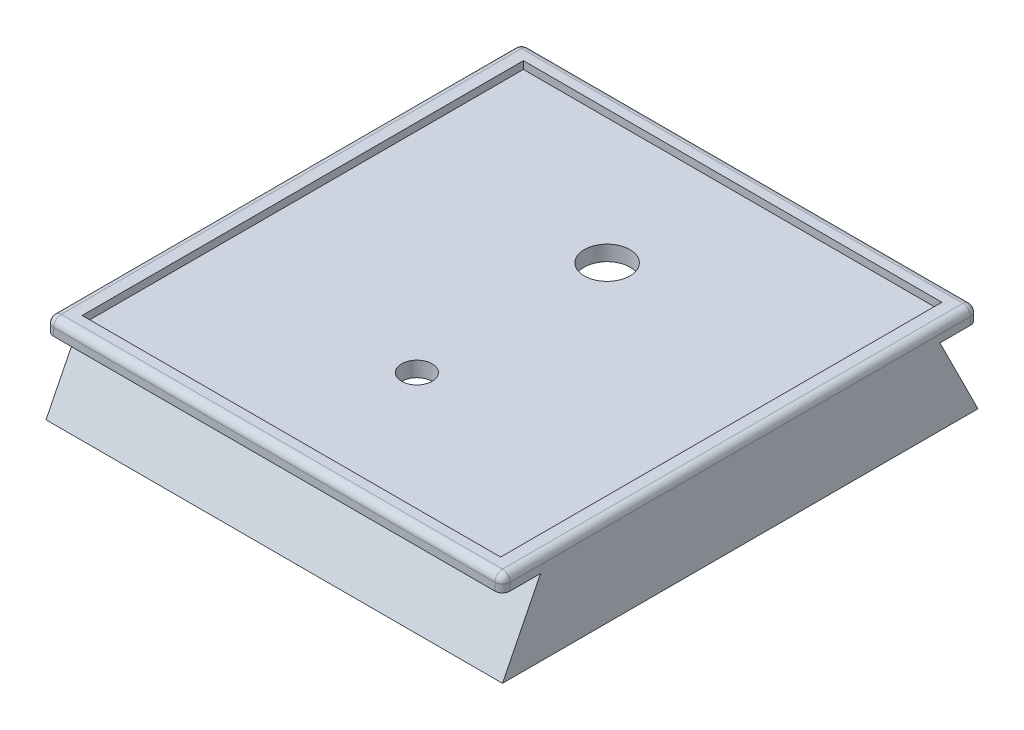
ISO-10303-21;
HEADER;
FILE_DESCRIPTION(('STEP AP214'),'2;1');
FILE_NAME('part.step','',(''),(''),'','','');
FILE_SCHEMA(('AUTOMOTIVE_DESIGN { 1 0 10303 214 1 1 1 1 }'));
ENDSEC;
DATA;
#1=APPLICATION_CONTEXT('core data for automotive mechanical design processes');
#2=APPLICATION_PROTOCOL_DEFINITION('international standard','automotive_design',2000,#1);
#3=PRODUCT_CONTEXT('',#1,'mechanical');
#4=PRODUCT('Part','Part','',(#3));
#5=PRODUCT_RELATED_PRODUCT_CATEGORY('part','',(#4));
#6=PRODUCT_DEFINITION_FORMATION('','',#4);
#7=PRODUCT_DEFINITION_CONTEXT('part definition',#1,'design');
#8=PRODUCT_DEFINITION('design','',#6,#7);
#9=PRODUCT_DEFINITION_SHAPE('','',#8);
#10=(LENGTH_UNIT() NAMED_UNIT(*) SI_UNIT(.MILLI.,.METRE.));
#11=(NAMED_UNIT(*) PLANE_ANGLE_UNIT() SI_UNIT($,.RADIAN.));
#12=(NAMED_UNIT(*) SI_UNIT($,.STERADIAN.) SOLID_ANGLE_UNIT());
#13=UNCERTAINTY_MEASURE_WITH_UNIT(LENGTH_MEASURE(1.E-05),#10,'distance_accuracy_value','');
#14=(GEOMETRIC_REPRESENTATION_CONTEXT(3) GLOBAL_UNCERTAINTY_ASSIGNED_CONTEXT((#13)) GLOBAL_UNIT_ASSIGNED_CONTEXT((#10,
#11,#12)) REPRESENTATION_CONTEXT('',''));
#15=CARTESIAN_POINT('',(0.,0.,0.));
#16=DIRECTION('',(0.,0.,1.));
#17=DIRECTION('',(1.,0.,0.));
#18=AXIS2_PLACEMENT_3D('',#15,#16,#17);
#19=CARTESIAN_POINT('',(-30.,10.,31.25));
#20=DIRECTION('',(1.,0.,0.));
#21=DIRECTION('',(0.,0.,-1.));
#22=AXIS2_PLACEMENT_3D('',#19,#20,#21);
#23=PLANE('',#22);
#24=DIRECTION('',(0.,-1.,0.));
#25=VECTOR('',#24,1.);
#26=CARTESIAN_POINT('',(-30.,10.,30.25));
#27=LINE('',#26,#25);
#28=CARTESIAN_POINT('',(-30.,10.,30.25));
#29=VERTEX_POINT('',#28);
#30=CARTESIAN_POINT('',(-30.,11.,30.25));
#31=VERTEX_POINT('',#30);
#32=EDGE_CURVE('E314',#29,#31,#27,.F.);
#33=ORIENTED_EDGE('',*,*,#32,.T.);
#34=DIRECTION('',(0.,0.,1.));
#35=VECTOR('',#34,1.);
#36=CARTESIAN_POINT('',(-30.,11.,-30.25));
#37=LINE('',#36,#35);
#38=CARTESIAN_POINT('',(-30.,11.,-30.25));
#39=VERTEX_POINT('',#38);
#40=EDGE_CURVE('E343',#31,#39,#37,.F.);
#41=ORIENTED_EDGE('',*,*,#40,.T.);
#42=DIRECTION('',(0.,-1.,0.));
#43=VECTOR('',#42,1.);
#44=CARTESIAN_POINT('',(-30.,10.,-30.25));
#45=LINE('',#44,#43);
#46=CARTESIAN_POINT('',(-30.,10.,-30.25));
#47=VERTEX_POINT('',#46);
#48=EDGE_CURVE('E319',#39,#47,#45,.T.);
#49=ORIENTED_EDGE('',*,*,#48,.T.);
#50=DIRECTION('',(0.,0.,1.));
#51=VECTOR('',#50,1.);
#52=CARTESIAN_POINT('',(-30.,10.,-31.25));
#53=LINE('',#52,#51);
#54=CARTESIAN_POINT('',(-30.,10.,-26.25));
#55=VERTEX_POINT('',#54);
#56=EDGE_CURVE('E275',#47,#55,#53,.T.);
#57=ORIENTED_EDGE('',*,*,#56,.T.);
#58=DIRECTION('',(0.,-0.894427190999916,-0.447213595499958));
#59=VECTOR('',#58,1.);
#60=CARTESIAN_POINT('',(-30.,0.,-31.25));
#61=LINE('',#60,#59);
#62=CARTESIAN_POINT('',(-30.,0.,-31.25));
#63=VERTEX_POINT('',#62);
#64=EDGE_CURVE('E283',#55,#63,#61,.T.);
#65=ORIENTED_EDGE('',*,*,#64,.T.);
#66=DIRECTION('',(0.,0.,1.));
#67=VECTOR('',#66,1.);
#68=CARTESIAN_POINT('',(-30.,0.,31.25));
#69=LINE('',#68,#67);
#70=CARTESIAN_POINT('',(-30.,0.,31.25));
#71=VERTEX_POINT('',#70);
#72=EDGE_CURVE('E293',#63,#71,#69,.T.);
#73=ORIENTED_EDGE('',*,*,#72,.T.);
#74=DIRECTION('',(0.,0.894427190999916,-0.447213595499958));
#75=VECTOR('',#74,1.);
#76=CARTESIAN_POINT('',(-30.,0.,31.25));
#77=LINE('',#76,#75);
#78=CARTESIAN_POINT('',(-30.,10.,26.25));
#79=VERTEX_POINT('',#78);
#80=EDGE_CURVE('E273',#71,#79,#77,.T.);
#81=ORIENTED_EDGE('',*,*,#80,.T.);
#82=EDGE_CURVE('E272',#79,#29,#53,.T.);
#83=ORIENTED_EDGE('',*,*,#82,.T.);
#84=EDGE_LOOP('',(#33,#41,#49,#57,#65,#73,#81,#83));
#85=FACE_BOUND('',#84,.T.);
#86=ADVANCED_FACE('F39',(#85),#23,.F.);
#87=CARTESIAN_POINT('',(30.,10.,31.25));
#88=DIRECTION('',(-1.,0.,0.));
#89=DIRECTION('',(0.,0.,1.));
#90=AXIS2_PLACEMENT_3D('',#87,#88,#89);
#91=PLANE('',#90);
#92=DIRECTION('',(0.,-1.,0.));
#93=VECTOR('',#92,1.);
#94=CARTESIAN_POINT('',(30.,10.,-30.25));
#95=LINE('',#94,#93);
#96=CARTESIAN_POINT('',(30.,10.,-30.25));
#97=VERTEX_POINT('',#96);
#98=CARTESIAN_POINT('',(30.,11.,-30.25));
#99=VERTEX_POINT('',#98);
#100=EDGE_CURVE('E315',#97,#99,#95,.F.);
#101=ORIENTED_EDGE('',*,*,#100,.T.);
#102=DIRECTION('',(0.,0.,-1.));
#103=VECTOR('',#102,1.);
#104=CARTESIAN_POINT('',(30.,11.,30.25));
#105=LINE('',#104,#103);
#106=CARTESIAN_POINT('',(30.,11.,30.25));
#107=VERTEX_POINT('',#106);
#108=EDGE_CURVE('E11',#99,#107,#105,.F.);
#109=ORIENTED_EDGE('',*,*,#108,.T.);
#110=DIRECTION('',(0.,-1.,0.));
#111=VECTOR('',#110,1.);
#112=CARTESIAN_POINT('',(30.,10.,30.25));
#113=LINE('',#112,#111);
#114=CARTESIAN_POINT('',(30.,10.,30.25));
#115=VERTEX_POINT('',#114);
#116=EDGE_CURVE('E309',#107,#115,#113,.T.);
#117=ORIENTED_EDGE('',*,*,#116,.T.);
#118=DIRECTION('',(0.,0.,-1.));
#119=VECTOR('',#118,1.);
#120=CARTESIAN_POINT('',(30.,10.,31.25));
#121=LINE('',#120,#119);
#122=CARTESIAN_POINT('',(30.,10.,26.25));
#123=VERTEX_POINT('',#122);
#124=EDGE_CURVE('E266',#115,#123,#121,.T.);
#125=ORIENTED_EDGE('',*,*,#124,.T.);
#126=DIRECTION('',(0.,0.894427190999916,-0.447213595499958));
#127=VECTOR('',#126,1.);
#128=CARTESIAN_POINT('',(30.,0.,31.25));
#129=LINE('',#128,#127);
#130=CARTESIAN_POINT('',(30.,0.,31.25));
#131=VERTEX_POINT('',#130);
#132=EDGE_CURVE('E274',#131,#123,#129,.T.);
#133=ORIENTED_EDGE('',*,*,#132,.F.);
#134=DIRECTION('',(0.,0.,-1.));
#135=VECTOR('',#134,1.);
#136=CARTESIAN_POINT('',(30.,0.,31.25));
#137=LINE('',#136,#135);
#138=CARTESIAN_POINT('',(30.,0.,-31.25));
#139=VERTEX_POINT('',#138);
#140=EDGE_CURVE('E298',#131,#139,#137,.T.);
#141=ORIENTED_EDGE('',*,*,#140,.T.);
#142=DIRECTION('',(0.,-0.894427190999916,-0.447213595499958));
#143=VECTOR('',#142,1.);
#144=CARTESIAN_POINT('',(30.,0.,-31.25));
#145=LINE('',#144,#143);
#146=CARTESIAN_POINT('',(30.,10.,-26.25));
#147=VERTEX_POINT('',#146);
#148=EDGE_CURVE('E282',#147,#139,#145,.T.);
#149=ORIENTED_EDGE('',*,*,#148,.F.);
#150=EDGE_CURVE('E263',#147,#97,#121,.T.);
#151=ORIENTED_EDGE('',*,*,#150,.T.);
#152=EDGE_LOOP('',(#101,#109,#117,#125,#133,#141,#149,#151));
#153=FACE_BOUND('',#152,.T.);
#154=ADVANCED_FACE('F427',(#153),#91,.F.);
#155=CARTESIAN_POINT('',(0.,0.,0.));
#156=DIRECTION('',(0.,1.,0.));
#157=DIRECTION('',(0.,0.,1.));
#158=AXIS2_PLACEMENT_3D('',#155,#156,#157);
#159=PLANE('',#158);
#160=DIRECTION('',(-1.,0.,0.));
#161=VECTOR('',#160,1.);
#162=CARTESIAN_POINT('',(-25.,0.,25.));
#163=LINE('',#162,#161);
#164=CARTESIAN_POINT('',(25.,0.,25.));
#165=VERTEX_POINT('',#164);
#166=CARTESIAN_POINT('',(-25.,0.,25.));
#167=VERTEX_POINT('',#166);
#168=EDGE_CURVE('E221',#165,#167,#163,.T.);
#169=ORIENTED_EDGE('',*,*,#168,.F.);
#170=DIRECTION('',(0.,0.,1.));
#171=VECTOR('',#170,1.);
#172=CARTESIAN_POINT('',(25.,0.,-25.));
#173=LINE('',#172,#171);
#174=CARTESIAN_POINT('',(25.,0.,-25.));
#175=VERTEX_POINT('',#174);
#176=EDGE_CURVE('E57',#175,#165,#173,.T.);
#177=ORIENTED_EDGE('',*,*,#176,.F.);
#178=DIRECTION('',(1.,0.,0.));
#179=VECTOR('',#178,1.);
#180=CARTESIAN_POINT('',(-25.,0.,-25.));
#181=LINE('',#180,#179);
#182=CARTESIAN_POINT('',(-25.,0.,-25.));
#183=VERTEX_POINT('',#182);
#184=EDGE_CURVE('E209',#183,#175,#181,.T.);
#185=ORIENTED_EDGE('',*,*,#184,.F.);
#186=DIRECTION('',(0.,0.,-1.));
#187=VECTOR('',#186,1.);
#188=CARTESIAN_POINT('',(-25.,0.,-25.));
#189=LINE('',#188,#187);
#190=EDGE_CURVE('E215',#167,#183,#189,.T.);
#191=ORIENTED_EDGE('',*,*,#190,.F.);
#192=EDGE_LOOP('',(#169,#177,#185,#191));
#193=FACE_BOUND('',#192,.T.);
#194=ORIENTED_EDGE('',*,*,#72,.F.);
#195=DIRECTION('',(-1.,0.,0.));
#196=VECTOR('',#195,1.);
#197=CARTESIAN_POINT('',(30.,0.,-31.25));
#198=LINE('',#197,#196);
#199=EDGE_CURVE('E299',#139,#63,#198,.T.);
#200=ORIENTED_EDGE('',*,*,#199,.F.);
#201=ORIENTED_EDGE('',*,*,#140,.F.);
#202=DIRECTION('',(1.,0.,0.));
#203=VECTOR('',#202,1.);
#204=CARTESIAN_POINT('',(30.,0.,31.25));
#205=LINE('',#204,#203);
#206=EDGE_CURVE('E295',#71,#131,#205,.T.);
#207=ORIENTED_EDGE('',*,*,#206,.F.);
#208=EDGE_LOOP('',(#194,#200,#201,#207));
#209=FACE_BOUND('',#208,.T.);
#210=ADVANCED_FACE('F438',(#193,#209),#159,.F.);
#211=CARTESIAN_POINT('',(-30.,0.,-31.25));
#212=DIRECTION('',(0.,-0.447213595499958,0.894427190999916));
#213=DIRECTION('',(0.,-0.894427190999916,-0.447213595499958));
#214=AXIS2_PLACEMENT_3D('',#211,#212,#213);
#215=PLANE('',#214);
#216=ORIENTED_EDGE('',*,*,#148,.T.);
#217=ORIENTED_EDGE('',*,*,#199,.T.);
#218=ORIENTED_EDGE('',*,*,#64,.F.);
#219=DIRECTION('',(1.,0.,0.));
#220=VECTOR('',#219,1.);
#221=CARTESIAN_POINT('',(-30.,10.,-26.25));
#222=LINE('',#221,#220);
#223=EDGE_CURVE('E290',#55,#147,#222,.T.);
#224=ORIENTED_EDGE('',*,*,#223,.T.);
#225=EDGE_LOOP('',(#216,#217,#218,#224));
#226=FACE_BOUND('',#225,.T.);
#227=ADVANCED_FACE('F432',(#226),#215,.F.);
#228=CARTESIAN_POINT('',(-30.,0.,31.25));
#229=DIRECTION('',(0.,-0.447213595499958,-0.894427190999916));
#230=DIRECTION('',(0.,0.894427190999916,-0.447213595499958));
#231=AXIS2_PLACEMENT_3D('',#228,#229,#230);
#232=PLANE('',#231);
#233=ORIENTED_EDGE('',*,*,#132,.T.);
#234=DIRECTION('',(1.,0.,0.));
#235=VECTOR('',#234,1.);
#236=CARTESIAN_POINT('',(-30.,10.,26.25));
#237=LINE('',#236,#235);
#238=EDGE_CURVE('E279',#79,#123,#237,.T.);
#239=ORIENTED_EDGE('',*,*,#238,.F.);
#240=ORIENTED_EDGE('',*,*,#80,.F.);
#241=ORIENTED_EDGE('',*,*,#206,.T.);
#242=EDGE_LOOP('',(#233,#239,#240,#241));
#243=FACE_BOUND('',#242,.T.);
#244=ADVANCED_FACE('F445',(#243),#232,.F.);
#245=CARTESIAN_POINT('',(0.,10.,0.));
#246=DIRECTION('',(0.,1.,0.));
#247=DIRECTION('',(0.,0.,1.));
#248=AXIS2_PLACEMENT_3D('',#245,#246,#247);
#249=PLANE('',#248);
#250=DIRECTION('',(1.,0.,0.));
#251=VECTOR('',#250,1.);
#252=CARTESIAN_POINT('',(-30.,10.,31.25));
#253=LINE('',#252,#251);
#254=CARTESIAN_POINT('',(-29.,10.,31.25));
#255=VERTEX_POINT('',#254);
#256=CARTESIAN_POINT('',(29.,10.,31.25));
#257=VERTEX_POINT('',#256);
#258=EDGE_CURVE('E261',#255,#257,#253,.T.);
#259=ORIENTED_EDGE('',*,*,#258,.F.);
#260=CARTESIAN_POINT('',(-29.,10.,30.25));
#261=DIRECTION('',(0.,1.,0.));
#262=DIRECTION('',(0.,0.,1.));
#263=AXIS2_PLACEMENT_3D('',#260,#261,#262);
#264=CIRCLE('',#263,1.);
#265=EDGE_CURVE('E330',#255,#29,#264,.F.);
#266=ORIENTED_EDGE('',*,*,#265,.T.);
#267=ORIENTED_EDGE('',*,*,#82,.F.);
#268=ORIENTED_EDGE('',*,*,#238,.T.);
#269=ORIENTED_EDGE('',*,*,#124,.F.);
#270=CARTESIAN_POINT('',(29.,10.,30.25));
#271=DIRECTION('',(0.,1.,0.));
#272=DIRECTION('',(0.,0.,1.));
#273=AXIS2_PLACEMENT_3D('',#270,#271,#272);
#274=CIRCLE('',#273,1.);
#275=EDGE_CURVE('E323',#115,#257,#274,.F.);
#276=ORIENTED_EDGE('',*,*,#275,.T.);
#277=EDGE_LOOP('',(#259,#266,#267,#268,#269,#276));
#278=FACE_BOUND('',#277,.T.);
#279=ADVANCED_FACE('F447',(#278),#249,.F.);
#280=CARTESIAN_POINT('',(-30.,12.,31.25));
#281=DIRECTION('',(0.,0.,-1.));
#282=DIRECTION('',(-1.,0.,0.));
#283=AXIS2_PLACEMENT_3D('',#280,#281,#282);
#284=PLANE('',#283);
#285=DIRECTION('',(0.,-1.,0.));
#286=VECTOR('',#285,1.);
#287=CARTESIAN_POINT('',(29.,12.,31.25));
#288=LINE('',#287,#286);
#289=CARTESIAN_POINT('',(29.,11.,31.25));
#290=VERTEX_POINT('',#289);
#291=EDGE_CURVE('E318',#257,#290,#288,.F.);
#292=ORIENTED_EDGE('',*,*,#291,.T.);
#293=DIRECTION('',(1.,0.,0.));
#294=VECTOR('',#293,1.);
#295=CARTESIAN_POINT('',(-29.,11.,31.25));
#296=LINE('',#295,#294);
#297=CARTESIAN_POINT('',(-29.,11.,31.25));
#298=VERTEX_POINT('',#297);
#299=EDGE_CURVE('E342',#290,#298,#296,.F.);
#300=ORIENTED_EDGE('',*,*,#299,.T.);
#301=DIRECTION('',(0.,-1.,0.));
#302=VECTOR('',#301,1.);
#303=CARTESIAN_POINT('',(-29.,12.,31.25));
#304=LINE('',#303,#302);
#305=EDGE_CURVE('E324',#298,#255,#304,.T.);
#306=ORIENTED_EDGE('',*,*,#305,.T.);
#307=ORIENTED_EDGE('',*,*,#258,.T.);
#308=EDGE_LOOP('',(#292,#300,#306,#307));
#309=FACE_BOUND('',#308,.T.);
#310=ADVANCED_FACE('F448',(#309),#284,.F.);
#311=CARTESIAN_POINT('',(30.,12.,-31.25));
#312=DIRECTION('',(0.,0.,1.));
#313=DIRECTION('',(1.,0.,0.));
#314=AXIS2_PLACEMENT_3D('',#311,#312,#313);
#315=PLANE('',#314);
#316=DIRECTION('',(0.,-1.,0.));
#317=VECTOR('',#316,1.);
#318=CARTESIAN_POINT('',(-29.,12.,-31.25));
#319=LINE('',#318,#317);
#320=CARTESIAN_POINT('',(-29.,10.,-31.25));
#321=VERTEX_POINT('',#320);
#322=CARTESIAN_POINT('',(-29.,11.,-31.25));
#323=VERTEX_POINT('',#322);
#324=EDGE_CURVE('E301',#321,#323,#319,.F.);
#325=ORIENTED_EDGE('',*,*,#324,.T.);
#326=DIRECTION('',(-1.,0.,0.));
#327=VECTOR('',#326,1.);
#328=CARTESIAN_POINT('',(29.,11.,-31.25));
#329=LINE('',#328,#327);
#330=CARTESIAN_POINT('',(29.,11.,-31.25));
#331=VERTEX_POINT('',#330);
#332=EDGE_CURVE('E348',#323,#331,#329,.F.);
#333=ORIENTED_EDGE('',*,*,#332,.T.);
#334=DIRECTION('',(0.,-1.,0.));
#335=VECTOR('',#334,1.);
#336=CARTESIAN_POINT('',(29.,12.,-31.25));
#337=LINE('',#336,#335);
#338=CARTESIAN_POINT('',(29.,10.,-31.25));
#339=VERTEX_POINT('',#338);
#340=EDGE_CURVE('E302',#331,#339,#337,.T.);
#341=ORIENTED_EDGE('',*,*,#340,.T.);
#342=DIRECTION('',(-1.,0.,0.));
#343=VECTOR('',#342,1.);
#344=CARTESIAN_POINT('',(30.,10.,-31.25));
#345=LINE('',#344,#343);
#346=EDGE_CURVE('E268',#339,#321,#345,.T.);
#347=ORIENTED_EDGE('',*,*,#346,.T.);
#348=EDGE_LOOP('',(#325,#333,#341,#347));
#349=FACE_BOUND('',#348,.T.);
#350=ADVANCED_FACE('F387',(#349),#315,.F.);
#351=CARTESIAN_POINT('',(0.,12.,0.));
#352=DIRECTION('',(0.,1.,0.));
#353=DIRECTION('',(0.,0.,1.));
#354=AXIS2_PLACEMENT_3D('',#351,#352,#353);
#355=PLANE('',#354);
#356=DIRECTION('',(0.,0.,1.));
#357=VECTOR('',#356,1.);
#358=CARTESIAN_POINT('',(-27.5,12.,29.));
#359=LINE('',#358,#357);
#360=CARTESIAN_POINT('',(-27.5,12.,-29.));
#361=VERTEX_POINT('',#360);
#362=CARTESIAN_POINT('',(-27.5,12.,29.));
#363=VERTEX_POINT('',#362);
#364=EDGE_CURVE('E61',#361,#363,#359,.T.);
#365=ORIENTED_EDGE('',*,*,#364,.F.);
#366=DIRECTION('',(-1.,0.,0.));
#367=VECTOR('',#366,1.);
#368=CARTESIAN_POINT('',(27.5,12.,-29.));
#369=LINE('',#368,#367);
#370=CARTESIAN_POINT('',(27.5,12.,-29.));
#371=VERTEX_POINT('',#370);
#372=EDGE_CURVE('E234',#371,#361,#369,.T.);
#373=ORIENTED_EDGE('',*,*,#372,.F.);
#374=DIRECTION('',(0.,0.,-1.));
#375=VECTOR('',#374,1.);
#376=CARTESIAN_POINT('',(27.5,12.,29.));
#377=LINE('',#376,#375);
#378=CARTESIAN_POINT('',(27.5,12.,29.));
#379=VERTEX_POINT('',#378);
#380=EDGE_CURVE('E247',#379,#371,#377,.T.);
#381=ORIENTED_EDGE('',*,*,#380,.F.);
#382=DIRECTION('',(1.,0.,0.));
#383=VECTOR('',#382,1.);
#384=CARTESIAN_POINT('',(27.5,12.,29.));
#385=LINE('',#384,#383);
#386=EDGE_CURVE('E244',#363,#379,#385,.T.);
#387=ORIENTED_EDGE('',*,*,#386,.F.);
#388=EDGE_LOOP('',(#365,#373,#381,#387));
#389=FACE_BOUND('',#388,.T.);
#390=DIRECTION('',(0.,0.,1.));
#391=VECTOR('',#390,1.);
#392=CARTESIAN_POINT('',(-29.,12.,30.25));
#393=LINE('',#392,#391);
#394=CARTESIAN_POINT('',(-29.,12.,-30.25));
#395=VERTEX_POINT('',#394);
#396=CARTESIAN_POINT('',(-29.,12.,30.25));
#397=VERTEX_POINT('',#396);
#398=EDGE_CURVE('E337',#395,#397,#393,.T.);
#399=ORIENTED_EDGE('',*,*,#398,.T.);
#400=DIRECTION('',(1.,0.,0.));
#401=VECTOR('',#400,1.);
#402=CARTESIAN_POINT('',(29.,12.,30.25));
#403=LINE('',#402,#401);
#404=CARTESIAN_POINT('',(29.,12.,30.25));
#405=VERTEX_POINT('',#404);
#406=EDGE_CURVE('E336',#397,#405,#403,.T.);
#407=ORIENTED_EDGE('',*,*,#406,.T.);
#408=DIRECTION('',(0.,0.,-1.));
#409=VECTOR('',#408,1.);
#410=CARTESIAN_POINT('',(29.,12.,-30.25));
#411=LINE('',#410,#409);
#412=CARTESIAN_POINT('',(29.,12.,-30.25));
#413=VERTEX_POINT('',#412);
#414=EDGE_CURVE('E335',#405,#413,#411,.T.);
#415=ORIENTED_EDGE('',*,*,#414,.T.);
#416=DIRECTION('',(-1.,0.,0.));
#417=VECTOR('',#416,1.);
#418=CARTESIAN_POINT('',(-29.,12.,-30.25));
#419=LINE('',#418,#417);
#420=EDGE_CURVE('E332',#413,#395,#419,.T.);
#421=ORIENTED_EDGE('',*,*,#420,.T.);
#422=EDGE_LOOP('',(#399,#407,#415,#421));
#423=FACE_BOUND('',#422,.T.);
#424=ADVANCED_FACE('F416',(#389,#423),#355,.T.);
#425=ORIENTED_EDGE('',*,*,#346,.F.);
#426=CARTESIAN_POINT('',(29.,10.,-30.25));
#427=DIRECTION('',(0.,1.,0.));
#428=DIRECTION('',(0.,0.,1.));
#429=AXIS2_PLACEMENT_3D('',#426,#427,#428);
#430=CIRCLE('',#429,1.);
#431=EDGE_CURVE('E308',#339,#97,#430,.F.);
#432=ORIENTED_EDGE('',*,*,#431,.T.);
#433=ORIENTED_EDGE('',*,*,#150,.F.);
#434=ORIENTED_EDGE('',*,*,#223,.F.);
#435=ORIENTED_EDGE('',*,*,#56,.F.);
#436=CARTESIAN_POINT('',(-29.,10.,-30.25));
#437=DIRECTION('',(0.,1.,0.));
#438=DIRECTION('',(0.,0.,1.));
#439=AXIS2_PLACEMENT_3D('',#436,#437,#438);
#440=CIRCLE('',#439,1.);
#441=EDGE_CURVE('E306',#47,#321,#440,.F.);
#442=ORIENTED_EDGE('',*,*,#441,.T.);
#443=EDGE_LOOP('',(#425,#432,#433,#434,#435,#442));
#444=FACE_BOUND('',#443,.T.);
#445=ADVANCED_FACE('F391',(#444),#249,.F.);
#446=CARTESIAN_POINT('',(29.,12.,-30.25));
#447=DIRECTION('',(0.,-1.,0.));
#448=DIRECTION('',(0.,0.,-1.));
#449=AXIS2_PLACEMENT_3D('',#446,#447,#448);
#450=CYLINDRICAL_SURFACE('',#449,1.);
#451=ORIENTED_EDGE('',*,*,#340,.F.);
#452=CARTESIAN_POINT('',(29.,11.,-30.25));
#453=DIRECTION('',(0.,-1.,0.));
#454=DIRECTION('',(0.,0.,-1.));
#455=AXIS2_PLACEMENT_3D('',#452,#453,#454);
#456=CIRCLE('',#455,1.);
#457=EDGE_CURVE('E48',#331,#99,#456,.T.);
#458=ORIENTED_EDGE('',*,*,#457,.T.);
#459=ORIENTED_EDGE('',*,*,#100,.F.);
#460=ORIENTED_EDGE('',*,*,#431,.F.);
#461=EDGE_LOOP('',(#451,#458,#459,#460));
#462=FACE_BOUND('',#461,.T.);
#463=ADVANCED_FACE('F426',(#462),#450,.T.);
#464=CARTESIAN_POINT('',(-29.,10.,-30.25));
#465=DIRECTION('',(0.,-1.,0.));
#466=DIRECTION('',(0.,0.,-1.));
#467=AXIS2_PLACEMENT_3D('',#464,#465,#466);
#468=CYLINDRICAL_SURFACE('',#467,1.);
#469=ORIENTED_EDGE('',*,*,#48,.F.);
#470=CARTESIAN_POINT('',(-29.,11.,-30.25));
#471=DIRECTION('',(0.,-1.,0.));
#472=DIRECTION('',(0.,0.,-1.));
#473=AXIS2_PLACEMENT_3D('',#470,#471,#472);
#474=CIRCLE('',#473,1.);
#475=EDGE_CURVE('E350',#39,#323,#474,.T.);
#476=ORIENTED_EDGE('',*,*,#475,.T.);
#477=ORIENTED_EDGE('',*,*,#324,.F.);
#478=ORIENTED_EDGE('',*,*,#441,.F.);
#479=EDGE_LOOP('',(#469,#476,#477,#478));
#480=FACE_BOUND('',#479,.T.);
#481=ADVANCED_FACE('F384',(#480),#468,.T.);
#482=CARTESIAN_POINT('',(-29.,12.,30.25));
#483=DIRECTION('',(0.,-1.,0.));
#484=DIRECTION('',(0.,0.,-1.));
#485=AXIS2_PLACEMENT_3D('',#482,#483,#484);
#486=CYLINDRICAL_SURFACE('',#485,1.);
#487=ORIENTED_EDGE('',*,*,#305,.F.);
#488=CARTESIAN_POINT('',(-29.,11.,30.25));
#489=DIRECTION('',(0.,-1.,0.));
#490=DIRECTION('',(0.,0.,-1.));
#491=AXIS2_PLACEMENT_3D('',#488,#489,#490);
#492=CIRCLE('',#491,1.);
#493=EDGE_CURVE('E344',#298,#31,#492,.T.);
#494=ORIENTED_EDGE('',*,*,#493,.T.);
#495=ORIENTED_EDGE('',*,*,#32,.F.);
#496=ORIENTED_EDGE('',*,*,#265,.F.);
#497=EDGE_LOOP('',(#487,#494,#495,#496));
#498=FACE_BOUND('',#497,.T.);
#499=ADVANCED_FACE('F401',(#498),#486,.T.);
#500=CARTESIAN_POINT('',(29.,10.,30.25));
#501=DIRECTION('',(0.,-1.,0.));
#502=DIRECTION('',(0.,0.,-1.));
#503=AXIS2_PLACEMENT_3D('',#500,#501,#502);
#504=CYLINDRICAL_SURFACE('',#503,1.);
#505=ORIENTED_EDGE('',*,*,#116,.F.);
#506=CARTESIAN_POINT('',(29.,11.,30.25));
#507=DIRECTION('',(0.,-1.,0.));
#508=DIRECTION('',(0.,0.,-1.));
#509=AXIS2_PLACEMENT_3D('',#506,#507,#508);
#510=CIRCLE('',#509,1.);
#511=EDGE_CURVE('E328',#107,#290,#510,.T.);
#512=ORIENTED_EDGE('',*,*,#511,.T.);
#513=ORIENTED_EDGE('',*,*,#291,.F.);
#514=ORIENTED_EDGE('',*,*,#275,.F.);
#515=EDGE_LOOP('',(#505,#512,#513,#514));
#516=FACE_BOUND('',#515,.T.);
#517=ADVANCED_FACE('F455',(#516),#504,.T.);
#518=CARTESIAN_POINT('',(-29.,11.,-30.25));
#519=DIRECTION('',(0.,1.,0.));
#520=DIRECTION('',(0.,0.,1.));
#521=AXIS2_PLACEMENT_3D('',#518,#519,#520);
#522=SPHERICAL_SURFACE('',#521,1.);
#523=CARTESIAN_POINT('',(-29.,11.,-30.25));
#524=DIRECTION('',(1.,0.,0.));
#525=DIRECTION('',(0.,0.,-1.));
#526=AXIS2_PLACEMENT_3D('',#523,#524,#525);
#527=CIRCLE('',#526,1.);
#528=EDGE_CURVE('E370',#323,#395,#527,.T.);
#529=ORIENTED_EDGE('',*,*,#528,.F.);
#530=ORIENTED_EDGE('',*,*,#475,.F.);
#531=CARTESIAN_POINT('',(-29.,11.,-30.25));
#532=DIRECTION('',(0.,0.,1.));
#533=DIRECTION('',(1.,0.,0.));
#534=AXIS2_PLACEMENT_3D('',#531,#532,#533);
#535=CIRCLE('',#534,1.);
#536=EDGE_CURVE('E264',#395,#39,#535,.T.);
#537=ORIENTED_EDGE('',*,*,#536,.F.);
#538=EDGE_LOOP('',(#529,#530,#537));
#539=FACE_BOUND('',#538,.T.);
#540=ADVANCED_FACE('F41',(#539),#522,.T.);
#541=CARTESIAN_POINT('',(-29.,11.,0.));
#542=DIRECTION('',(0.,0.,-1.));
#543=DIRECTION('',(-1.,0.,0.));
#544=AXIS2_PLACEMENT_3D('',#541,#542,#543);
#545=CYLINDRICAL_SURFACE('',#544,1.);
#546=ORIENTED_EDGE('',*,*,#536,.T.);
#547=ORIENTED_EDGE('',*,*,#40,.F.);
#548=CARTESIAN_POINT('',(-29.,11.,30.25));
#549=DIRECTION('',(0.,0.,1.));
#550=DIRECTION('',(1.,0.,0.));
#551=AXIS2_PLACEMENT_3D('',#548,#549,#550);
#552=CIRCLE('',#551,1.);
#553=EDGE_CURVE('E364',#397,#31,#552,.T.);
#554=ORIENTED_EDGE('',*,*,#553,.F.);
#555=ORIENTED_EDGE('',*,*,#398,.F.);
#556=EDGE_LOOP('',(#546,#547,#554,#555));
#557=FACE_BOUND('',#556,.T.);
#558=ADVANCED_FACE('F372',(#557),#545,.T.);
#559=CARTESIAN_POINT('',(0.,11.,-30.25));
#560=DIRECTION('',(1.,0.,0.));
#561=DIRECTION('',(0.,0.,-1.));
#562=AXIS2_PLACEMENT_3D('',#559,#560,#561);
#563=CYLINDRICAL_SURFACE('',#562,1.);
#564=ORIENTED_EDGE('',*,*,#528,.T.);
#565=ORIENTED_EDGE('',*,*,#420,.F.);
#566=CARTESIAN_POINT('',(29.,11.,-30.25));
#567=DIRECTION('',(1.,0.,0.));
#568=DIRECTION('',(0.,0.,-1.));
#569=AXIS2_PLACEMENT_3D('',#566,#567,#568);
#570=CIRCLE('',#569,1.);
#571=EDGE_CURVE('E363',#331,#413,#570,.T.);
#572=ORIENTED_EDGE('',*,*,#571,.F.);
#573=ORIENTED_EDGE('',*,*,#332,.F.);
#574=EDGE_LOOP('',(#564,#565,#572,#573));
#575=FACE_BOUND('',#574,.T.);
#576=ADVANCED_FACE('F419',(#575),#563,.T.);
#577=CARTESIAN_POINT('',(-29.,11.,30.25));
#578=DIRECTION('',(0.,1.,0.));
#579=DIRECTION('',(0.,0.,1.));
#580=AXIS2_PLACEMENT_3D('',#577,#578,#579);
#581=SPHERICAL_SURFACE('',#580,1.);
#582=ORIENTED_EDGE('',*,*,#553,.T.);
#583=ORIENTED_EDGE('',*,*,#493,.F.);
#584=CARTESIAN_POINT('',(-29.,11.,30.25));
#585=DIRECTION('',(1.,0.,0.));
#586=DIRECTION('',(0.,0.,-1.));
#587=AXIS2_PLACEMENT_3D('',#584,#585,#586);
#588=CIRCLE('',#587,1.);
#589=EDGE_CURVE('E356',#397,#298,#588,.T.);
#590=ORIENTED_EDGE('',*,*,#589,.F.);
#591=EDGE_LOOP('',(#582,#583,#590));
#592=FACE_BOUND('',#591,.T.);
#593=ADVANCED_FACE('F409',(#592),#581,.T.);
#594=CARTESIAN_POINT('',(29.,11.,-30.25));
#595=DIRECTION('',(0.,1.,0.));
#596=DIRECTION('',(0.,0.,1.));
#597=AXIS2_PLACEMENT_3D('',#594,#595,#596);
#598=SPHERICAL_SURFACE('',#597,1.);
#599=ORIENTED_EDGE('',*,*,#457,.F.);
#600=ORIENTED_EDGE('',*,*,#571,.T.);
#601=CARTESIAN_POINT('',(29.,11.,-30.25));
#602=DIRECTION('',(0.,0.,1.));
#603=DIRECTION('',(1.,0.,0.));
#604=AXIS2_PLACEMENT_3D('',#601,#602,#603);
#605=CIRCLE('',#604,1.);
#606=EDGE_CURVE('E354',#99,#413,#605,.T.);
#607=ORIENTED_EDGE('',*,*,#606,.F.);
#608=EDGE_LOOP('',(#599,#600,#607));
#609=FACE_BOUND('',#608,.T.);
#610=ADVANCED_FACE('F425',(#609),#598,.T.);
#611=CARTESIAN_POINT('',(0.,11.,30.25));
#612=DIRECTION('',(-1.,0.,0.));
#613=DIRECTION('',(0.,0.,1.));
#614=AXIS2_PLACEMENT_3D('',#611,#612,#613);
#615=CYLINDRICAL_SURFACE('',#614,1.);
#616=ORIENTED_EDGE('',*,*,#589,.T.);
#617=ORIENTED_EDGE('',*,*,#299,.F.);
#618=CARTESIAN_POINT('',(29.,11.,30.25));
#619=DIRECTION('',(1.,0.,0.));
#620=DIRECTION('',(0.,0.,-1.));
#621=AXIS2_PLACEMENT_3D('',#618,#619,#620);
#622=CIRCLE('',#621,1.);
#623=EDGE_CURVE('E353',#405,#290,#622,.T.);
#624=ORIENTED_EDGE('',*,*,#623,.F.);
#625=ORIENTED_EDGE('',*,*,#406,.F.);
#626=EDGE_LOOP('',(#616,#617,#624,#625));
#627=FACE_BOUND('',#626,.T.);
#628=ADVANCED_FACE('F415',(#627),#615,.T.);
#629=CARTESIAN_POINT('',(29.,11.,0.));
#630=DIRECTION('',(0.,0.,1.));
#631=DIRECTION('',(1.,0.,0.));
#632=AXIS2_PLACEMENT_3D('',#629,#630,#631);
#633=CYLINDRICAL_SURFACE('',#632,1.);
#634=ORIENTED_EDGE('',*,*,#606,.T.);
#635=ORIENTED_EDGE('',*,*,#414,.F.);
#636=CARTESIAN_POINT('',(29.,11.,30.25));
#637=DIRECTION('',(0.,0.,1.));
#638=DIRECTION('',(1.,0.,0.));
#639=AXIS2_PLACEMENT_3D('',#636,#637,#638);
#640=CIRCLE('',#639,1.);
#641=EDGE_CURVE('E253',#107,#405,#640,.T.);
#642=ORIENTED_EDGE('',*,*,#641,.F.);
#643=ORIENTED_EDGE('',*,*,#108,.F.);
#644=EDGE_LOOP('',(#634,#635,#642,#643));
#645=FACE_BOUND('',#644,.T.);
#646=ADVANCED_FACE('F457',(#645),#633,.T.);
#647=CARTESIAN_POINT('',(29.,11.,30.25));
#648=DIRECTION('',(0.,1.,0.));
#649=DIRECTION('',(0.,0.,1.));
#650=AXIS2_PLACEMENT_3D('',#647,#648,#649);
#651=SPHERICAL_SURFACE('',#650,1.);
#652=ORIENTED_EDGE('',*,*,#623,.T.);
#653=ORIENTED_EDGE('',*,*,#511,.F.);
#654=ORIENTED_EDGE('',*,*,#641,.T.);
#655=EDGE_LOOP('',(#652,#653,#654));
#656=FACE_BOUND('',#655,.T.);
#657=ADVANCED_FACE('F456',(#656),#651,.T.);
#658=CARTESIAN_POINT('',(-27.5,11.,29.));
#659=DIRECTION('',(-1.,0.,0.));
#660=DIRECTION('',(0.,0.,1.));
#661=AXIS2_PLACEMENT_3D('',#658,#659,#660);
#662=PLANE('',#661);
#663=ORIENTED_EDGE('',*,*,#364,.T.);
#664=DIRECTION('',(0.,1.,0.));
#665=VECTOR('',#664,1.);
#666=CARTESIAN_POINT('',(-27.5,11.,29.));
#667=LINE('',#666,#665);
#668=CARTESIAN_POINT('',(-27.5,11.,29.));
#669=VERTEX_POINT('',#668);
#670=EDGE_CURVE('E243',#669,#363,#667,.T.);
#671=ORIENTED_EDGE('',*,*,#670,.F.);
#672=DIRECTION('',(0.,0.,1.));
#673=VECTOR('',#672,1.);
#674=CARTESIAN_POINT('',(-27.5,11.,29.));
#675=LINE('',#674,#673);
#676=CARTESIAN_POINT('',(-27.5,11.,-29.));
#677=VERTEX_POINT('',#676);
#678=EDGE_CURVE('E229',#677,#669,#675,.T.);
#679=ORIENTED_EDGE('',*,*,#678,.F.);
#680=DIRECTION('',(0.,1.,0.));
#681=VECTOR('',#680,1.);
#682=CARTESIAN_POINT('',(-27.5,11.,-29.));
#683=LINE('',#682,#681);
#684=EDGE_CURVE('E254',#677,#361,#683,.T.);
#685=ORIENTED_EDGE('',*,*,#684,.T.);
#686=EDGE_LOOP('',(#663,#671,#679,#685));
#687=FACE_BOUND('',#686,.T.);
#688=ADVANCED_FACE('F464',(#687),#662,.F.);
#689=CARTESIAN_POINT('',(27.5,11.,-29.));
#690=DIRECTION('',(0.,0.,-1.));
#691=DIRECTION('',(-1.,0.,0.));
#692=AXIS2_PLACEMENT_3D('',#689,#690,#691);
#693=PLANE('',#692);
#694=ORIENTED_EDGE('',*,*,#372,.T.);
#695=ORIENTED_EDGE('',*,*,#684,.F.);
#696=DIRECTION('',(-1.,0.,0.));
#697=VECTOR('',#696,1.);
#698=CARTESIAN_POINT('',(27.5,11.,-29.));
#699=LINE('',#698,#697);
#700=CARTESIAN_POINT('',(27.5,11.,-29.));
#701=VERTEX_POINT('',#700);
#702=EDGE_CURVE('E239',#701,#677,#699,.T.);
#703=ORIENTED_EDGE('',*,*,#702,.F.);
#704=DIRECTION('',(0.,1.,0.));
#705=VECTOR('',#704,1.);
#706=CARTESIAN_POINT('',(27.5,11.,-29.));
#707=LINE('',#706,#705);
#708=EDGE_CURVE('E257',#701,#371,#707,.T.);
#709=ORIENTED_EDGE('',*,*,#708,.T.);
#710=EDGE_LOOP('',(#694,#695,#703,#709));
#711=FACE_BOUND('',#710,.T.);
#712=ADVANCED_FACE('F523',(#711),#693,.F.);
#713=CARTESIAN_POINT('',(27.5,11.,29.));
#714=DIRECTION('',(1.,0.,0.));
#715=DIRECTION('',(0.,0.,-1.));
#716=AXIS2_PLACEMENT_3D('',#713,#714,#715);
#717=PLANE('',#716);
#718=ORIENTED_EDGE('',*,*,#380,.T.);
#719=ORIENTED_EDGE('',*,*,#708,.F.);
#720=DIRECTION('',(0.,0.,-1.));
#721=VECTOR('',#720,1.);
#722=CARTESIAN_POINT('',(27.5,11.,29.));
#723=LINE('',#722,#721);
#724=CARTESIAN_POINT('',(27.5,11.,29.));
#725=VERTEX_POINT('',#724);
#726=EDGE_CURVE('E240',#725,#701,#723,.T.);
#727=ORIENTED_EDGE('',*,*,#726,.F.);
#728=DIRECTION('',(0.,1.,0.));
#729=VECTOR('',#728,1.);
#730=CARTESIAN_POINT('',(27.5,11.,29.));
#731=LINE('',#730,#729);
#732=EDGE_CURVE('E259',#725,#379,#731,.T.);
#733=ORIENTED_EDGE('',*,*,#732,.T.);
#734=EDGE_LOOP('',(#718,#719,#727,#733));
#735=FACE_BOUND('',#734,.T.);
#736=ADVANCED_FACE('F532',(#735),#717,.F.);
#737=CARTESIAN_POINT('',(27.5,11.,29.));
#738=DIRECTION('',(0.,0.,1.));
#739=DIRECTION('',(1.,0.,0.));
#740=AXIS2_PLACEMENT_3D('',#737,#738,#739);
#741=PLANE('',#740);
#742=ORIENTED_EDGE('',*,*,#386,.T.);
#743=ORIENTED_EDGE('',*,*,#732,.F.);
#744=DIRECTION('',(1.,0.,0.));
#745=VECTOR('',#744,1.);
#746=CARTESIAN_POINT('',(27.5,11.,29.));
#747=LINE('',#746,#745);
#748=EDGE_CURVE('E231',#669,#725,#747,.T.);
#749=ORIENTED_EDGE('',*,*,#748,.F.);
#750=ORIENTED_EDGE('',*,*,#670,.T.);
#751=EDGE_LOOP('',(#742,#743,#749,#750));
#752=FACE_BOUND('',#751,.T.);
#753=ADVANCED_FACE('F536',(#752),#741,.F.);
#754=CARTESIAN_POINT('',(0.,11.,0.));
#755=DIRECTION('',(0.,1.,0.));
#756=DIRECTION('',(0.,0.,1.));
#757=AXIS2_PLACEMENT_3D('',#754,#755,#756);
#758=PLANE('',#757);
#759=CARTESIAN_POINT('',(0.,11.,12.5));
#760=DIRECTION('',(0.,1.,0.));
#761=DIRECTION('',(0.,0.,1.));
#762=AXIS2_PLACEMENT_3D('',#759,#760,#761);
#763=CIRCLE('',#762,2.);
#764=CARTESIAN_POINT('',(0.,11.,14.5));
#765=VERTEX_POINT('',#764);
#766=EDGE_CURVE('E710',#765,#765,#763,.T.);
#767=ORIENTED_EDGE('',*,*,#766,.F.);
#768=EDGE_LOOP('',(#767));
#769=FACE_BOUND('',#768,.T.);
#770=CARTESIAN_POINT('',(0.,11.,-12.5));
#771=DIRECTION('',(0.,1.,0.));
#772=DIRECTION('',(0.,0.,1.));
#773=AXIS2_PLACEMENT_3D('',#770,#771,#772);
#774=CIRCLE('',#773,3.);
#775=CARTESIAN_POINT('',(0.,11.,-9.5));
#776=VERTEX_POINT('',#775);
#777=EDGE_CURVE('E213',#776,#776,#774,.T.);
#778=ORIENTED_EDGE('',*,*,#777,.F.);
#779=EDGE_LOOP('',(#778));
#780=FACE_BOUND('',#779,.T.);
#781=ORIENTED_EDGE('',*,*,#678,.T.);
#782=ORIENTED_EDGE('',*,*,#748,.T.);
#783=ORIENTED_EDGE('',*,*,#726,.T.);
#784=ORIENTED_EDGE('',*,*,#702,.T.);
#785=EDGE_LOOP('',(#781,#782,#783,#784));
#786=FACE_BOUND('',#785,.T.);
#787=ADVANCED_FACE('F550',(#769,#780,#786),#758,.T.);
#788=CARTESIAN_POINT('',(25.,9.,-25.));
#789=DIRECTION('',(1.,0.,0.));
#790=DIRECTION('',(0.,0.,-1.));
#791=AXIS2_PLACEMENT_3D('',#788,#789,#790);
#792=PLANE('',#791);
#793=ORIENTED_EDGE('',*,*,#176,.T.);
#794=DIRECTION('',(0.,-1.,0.));
#795=VECTOR('',#794,1.);
#796=CARTESIAN_POINT('',(25.,9.,25.));
#797=LINE('',#796,#795);
#798=CARTESIAN_POINT('',(25.,9.,25.));
#799=VERTEX_POINT('',#798);
#800=EDGE_CURVE('E190',#799,#165,#797,.T.);
#801=ORIENTED_EDGE('',*,*,#800,.F.);
#802=DIRECTION('',(0.,0.,1.));
#803=VECTOR('',#802,1.);
#804=CARTESIAN_POINT('',(25.,9.,-25.));
#805=LINE('',#804,#803);
#806=CARTESIAN_POINT('',(25.,9.,-25.));
#807=VERTEX_POINT('',#806);
#808=EDGE_CURVE('E192',#807,#799,#805,.T.);
#809=ORIENTED_EDGE('',*,*,#808,.F.);
#810=DIRECTION('',(0.,-1.,0.));
#811=VECTOR('',#810,1.);
#812=CARTESIAN_POINT('',(25.,9.,-25.));
#813=LINE('',#812,#811);
#814=EDGE_CURVE('E224',#807,#175,#813,.T.);
#815=ORIENTED_EDGE('',*,*,#814,.T.);
#816=EDGE_LOOP('',(#793,#801,#809,#815));
#817=FACE_BOUND('',#816,.T.);
#818=ADVANCED_FACE('F186',(#817),#792,.F.);
#819=CARTESIAN_POINT('',(-25.,9.,-25.));
#820=DIRECTION('',(0.,0.,-1.));
#821=DIRECTION('',(-1.,0.,0.));
#822=AXIS2_PLACEMENT_3D('',#819,#820,#821);
#823=PLANE('',#822);
#824=ORIENTED_EDGE('',*,*,#184,.T.);
#825=ORIENTED_EDGE('',*,*,#814,.F.);
#826=DIRECTION('',(1.,0.,0.));
#827=VECTOR('',#826,1.);
#828=CARTESIAN_POINT('',(-25.,9.,-25.));
#829=LINE('',#828,#827);
#830=CARTESIAN_POINT('',(-25.,9.,-25.));
#831=VERTEX_POINT('',#830);
#832=EDGE_CURVE('E200',#831,#807,#829,.T.);
#833=ORIENTED_EDGE('',*,*,#832,.F.);
#834=DIRECTION('',(0.,-1.,0.));
#835=VECTOR('',#834,1.);
#836=CARTESIAN_POINT('',(-25.,9.,-25.));
#837=LINE('',#836,#835);
#838=EDGE_CURVE('E227',#831,#183,#837,.T.);
#839=ORIENTED_EDGE('',*,*,#838,.T.);
#840=EDGE_LOOP('',(#824,#825,#833,#839));
#841=FACE_BOUND('',#840,.T.);
#842=ADVANCED_FACE('F564',(#841),#823,.F.);
#843=CARTESIAN_POINT('',(-25.,9.,-25.));
#844=DIRECTION('',(-1.,0.,0.));
#845=DIRECTION('',(0.,0.,1.));
#846=AXIS2_PLACEMENT_3D('',#843,#844,#845);
#847=PLANE('',#846);
#848=ORIENTED_EDGE('',*,*,#190,.T.);
#849=ORIENTED_EDGE('',*,*,#838,.F.);
#850=DIRECTION('',(0.,0.,-1.));
#851=VECTOR('',#850,1.);
#852=CARTESIAN_POINT('',(-25.,9.,-25.));
#853=LINE('',#852,#851);
#854=CARTESIAN_POINT('',(-25.,9.,25.));
#855=VERTEX_POINT('',#854);
#856=EDGE_CURVE('E204',#855,#831,#853,.T.);
#857=ORIENTED_EDGE('',*,*,#856,.F.);
#858=DIRECTION('',(0.,-1.,0.));
#859=VECTOR('',#858,1.);
#860=CARTESIAN_POINT('',(-25.,9.,25.));
#861=LINE('',#860,#859);
#862=EDGE_CURVE('E196',#855,#167,#861,.T.);
#863=ORIENTED_EDGE('',*,*,#862,.T.);
#864=EDGE_LOOP('',(#848,#849,#857,#863));
#865=FACE_BOUND('',#864,.T.);
#866=ADVANCED_FACE('F575',(#865),#847,.F.);
#867=CARTESIAN_POINT('',(-25.,9.,25.));
#868=DIRECTION('',(0.,0.,1.));
#869=DIRECTION('',(1.,0.,0.));
#870=AXIS2_PLACEMENT_3D('',#867,#868,#869);
#871=PLANE('',#870);
#872=ORIENTED_EDGE('',*,*,#168,.T.);
#873=ORIENTED_EDGE('',*,*,#862,.F.);
#874=DIRECTION('',(-1.,0.,0.));
#875=VECTOR('',#874,1.);
#876=CARTESIAN_POINT('',(-25.,9.,25.));
#877=LINE('',#876,#875);
#878=EDGE_CURVE('E199',#799,#855,#877,.T.);
#879=ORIENTED_EDGE('',*,*,#878,.F.);
#880=ORIENTED_EDGE('',*,*,#800,.T.);
#881=EDGE_LOOP('',(#872,#873,#879,#880));
#882=FACE_BOUND('',#881,.T.);
#883=ADVANCED_FACE('F201',(#882),#871,.F.);
#884=CARTESIAN_POINT('',(0.,9.,0.));
#885=DIRECTION('',(0.,1.,0.));
#886=DIRECTION('',(0.,0.,1.));
#887=AXIS2_PLACEMENT_3D('',#884,#885,#886);
#888=PLANE('',#887);
#889=CARTESIAN_POINT('',(0.,9.,12.5));
#890=DIRECTION('',(0.,1.,0.));
#891=DIRECTION('',(0.,0.,1.));
#892=AXIS2_PLACEMENT_3D('',#889,#890,#891);
#893=CIRCLE('',#892,2.);
#894=CARTESIAN_POINT('',(0.,9.,14.5));
#895=VERTEX_POINT('',#894);
#896=EDGE_CURVE('E43',#895,#895,#893,.T.);
#897=ORIENTED_EDGE('',*,*,#896,.T.);
#898=EDGE_LOOP('',(#897));
#899=FACE_BOUND('',#898,.T.);
#900=CARTESIAN_POINT('',(0.,9.,-12.5));
#901=DIRECTION('',(0.,-1.,0.));
#902=DIRECTION('',(0.,0.,-1.));
#903=AXIS2_PLACEMENT_3D('',#900,#901,#902);
#904=CIRCLE('',#903,3.);
#905=CARTESIAN_POINT('',(0.,9.,-15.5));
#906=VERTEX_POINT('',#905);
#907=EDGE_CURVE('E708',#906,#906,#904,.T.);
#908=ORIENTED_EDGE('',*,*,#907,.F.);
#909=EDGE_LOOP('',(#908));
#910=FACE_BOUND('',#909,.T.);
#911=ORIENTED_EDGE('',*,*,#808,.T.);
#912=ORIENTED_EDGE('',*,*,#878,.T.);
#913=ORIENTED_EDGE('',*,*,#856,.T.);
#914=ORIENTED_EDGE('',*,*,#832,.T.);
#915=EDGE_LOOP('',(#911,#912,#913,#914));
#916=FACE_BOUND('',#915,.T.);
#917=ADVANCED_FACE('F210',(#899,#910,#916),#888,.F.);
#918=CARTESIAN_POINT('',(0.,18.,-12.5));
#919=DIRECTION('',(0.,-1.,0.));
#920=DIRECTION('',(0.,0.,-1.));
#921=AXIS2_PLACEMENT_3D('',#918,#919,#920);
#922=CYLINDRICAL_SURFACE('',#921,3.);
#923=ORIENTED_EDGE('',*,*,#777,.T.);
#924=EDGE_LOOP('',(#923));
#925=FACE_BOUND('',#924,.T.);
#926=ORIENTED_EDGE('',*,*,#907,.T.);
#927=EDGE_LOOP('',(#926));
#928=FACE_BOUND('',#927,.T.);
#929=ADVANCED_FACE('F595',(#925,#928),#922,.F.);
#930=CARTESIAN_POINT('',(0.,0.999999999999999,12.5));
#931=DIRECTION('',(0.,1.,0.));
#932=DIRECTION('',(0.,0.,1.));
#933=AXIS2_PLACEMENT_3D('',#930,#931,#932);
#934=CYLINDRICAL_SURFACE('',#933,2.);
#935=ORIENTED_EDGE('',*,*,#766,.T.);
#936=EDGE_LOOP('',(#935));
#937=FACE_BOUND('',#936,.T.);
#938=ORIENTED_EDGE('',*,*,#896,.F.);
#939=EDGE_LOOP('',(#938));
#940=FACE_BOUND('',#939,.T.);
#941=ADVANCED_FACE('F598',(#937,#940),#934,.F.);
#942=CLOSED_SHELL('',(#86,#154,#210,#227,#244,#279,#310,#350,#424,#445,#463,#481,#499,#517,#540,
#558,#576,#593,#610,#628,#646,#657,#688,#712,#736,#753,#787,#818,#842,#866,#883,#917,#929,#941));
#943=MANIFOLD_SOLID_BREP('B2',#942);
#944=ADVANCED_BREP_SHAPE_REPRESENTATION('',(#18,#943),#14);
#945=SHAPE_DEFINITION_REPRESENTATION(#9,#944);
ENDSEC;
END-ISO-10303-21;
